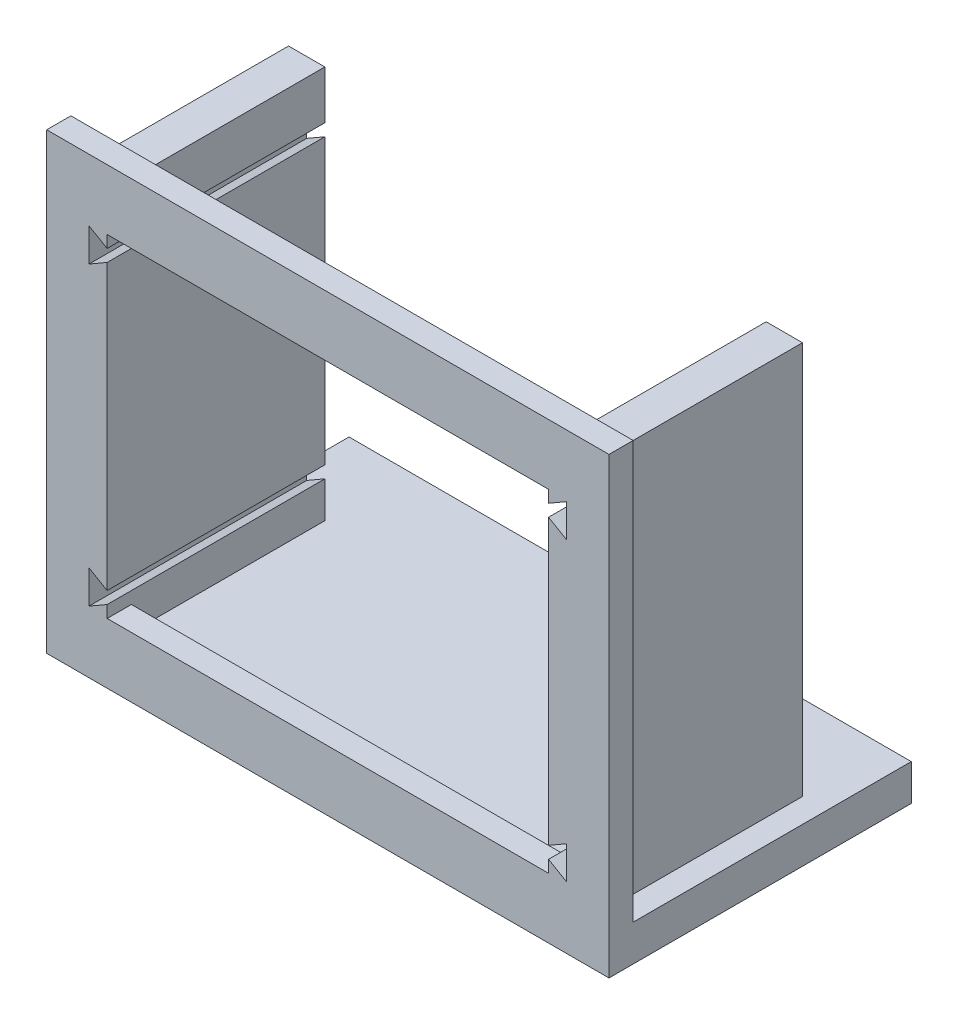
ISO-10303-21;
HEADER;
FILE_DESCRIPTION(('STEP AP214'),'2;1');
FILE_NAME('part.step','',(''),(''),'','','');
FILE_SCHEMA(('AUTOMOTIVE_DESIGN { 1 0 10303 214 1 1 1 1 }'));
ENDSEC;
DATA;
#1=APPLICATION_CONTEXT('core data for automotive mechanical design processes');
#2=APPLICATION_PROTOCOL_DEFINITION('international standard','automotive_design',2000,#1);
#3=PRODUCT_CONTEXT('',#1,'mechanical');
#4=PRODUCT('Part','Part','',(#3));
#5=PRODUCT_RELATED_PRODUCT_CATEGORY('part','',(#4));
#6=PRODUCT_DEFINITION_FORMATION('','',#4);
#7=PRODUCT_DEFINITION_CONTEXT('part definition',#1,'design');
#8=PRODUCT_DEFINITION('design','',#6,#7);
#9=PRODUCT_DEFINITION_SHAPE('','',#8);
#10=(LENGTH_UNIT() NAMED_UNIT(*) SI_UNIT(.MILLI.,.METRE.));
#11=(NAMED_UNIT(*) PLANE_ANGLE_UNIT() SI_UNIT($,.RADIAN.));
#12=(NAMED_UNIT(*) SI_UNIT($,.STERADIAN.) SOLID_ANGLE_UNIT());
#13=UNCERTAINTY_MEASURE_WITH_UNIT(LENGTH_MEASURE(1.E-05),#10,'distance_accuracy_value','');
#14=(GEOMETRIC_REPRESENTATION_CONTEXT(3) GLOBAL_UNCERTAINTY_ASSIGNED_CONTEXT((#13)) GLOBAL_UNIT_ASSIGNED_CONTEXT((#10,
#11,#12)) REPRESENTATION_CONTEXT('',''));
#15=CARTESIAN_POINT('',(0.,0.,0.));
#16=DIRECTION('',(0.,0.,1.));
#17=DIRECTION('',(1.,0.,0.));
#18=AXIS2_PLACEMENT_3D('',#15,#16,#17);
#19=CARTESIAN_POINT('',(-23.25,11.99,50.));
#20=DIRECTION('',(0.,0.,-1.));
#21=DIRECTION('',(-1.,0.,0.));
#22=AXIS2_PLACEMENT_3D('',#19,#20,#21);
#23=PLANE('',#22);
#24=DIRECTION('',(1.,0.,0.));
#25=VECTOR('',#24,1.);
#26=CARTESIAN_POINT('',(-23.25,12.,50.));
#27=LINE('',#26,#25);
#28=CARTESIAN_POINT('',(-23.25,12.,50.));
#29=VERTEX_POINT('',#28);
#30=CARTESIAN_POINT('',(23.25,12.,50.));
#31=VERTEX_POINT('',#30);
#32=EDGE_CURVE('E616',#29,#31,#27,.T.);
#33=ORIENTED_EDGE('',*,*,#32,.F.);
#34=DIRECTION('',(0.,-1.,0.));
#35=VECTOR('',#34,1.);
#36=CARTESIAN_POINT('',(-23.25,49.5,50.));
#37=LINE('',#36,#35);
#38=CARTESIAN_POINT('',(-23.25,15.,50.));
#39=VERTEX_POINT('',#38);
#40=EDGE_CURVE('E607',#39,#29,#37,.T.);
#41=ORIENTED_EDGE('',*,*,#40,.F.);
#42=DIRECTION('',(-1.,0.,0.));
#43=VECTOR('',#42,1.);
#44=CARTESIAN_POINT('',(0.,15.,50.));
#45=LINE('',#44,#43);
#46=CARTESIAN_POINT('',(23.25,15.,50.));
#47=VERTEX_POINT('',#46);
#48=EDGE_CURVE('E629',#47,#39,#45,.T.);
#49=ORIENTED_EDGE('',*,*,#48,.F.);
#50=DIRECTION('',(0.,1.,0.));
#51=VECTOR('',#50,1.);
#52=CARTESIAN_POINT('',(23.25,49.5,50.));
#53=LINE('',#52,#51);
#54=EDGE_CURVE('E615',#31,#47,#53,.T.);
#55=ORIENTED_EDGE('',*,*,#54,.F.);
#56=EDGE_LOOP('',(#33,#41,#49,#55));
#57=FACE_BOUND('',#56,.T.);
#58=ADVANCED_FACE('F382',(#57),#23,.T.);
#59=CARTESIAN_POINT('',(23.25,49.5,-75.01));
#60=DIRECTION('',(1.,0.,0.));
#61=DIRECTION('',(0.,0.,-1.));
#62=AXIS2_PLACEMENT_3D('',#59,#60,#61);
#63=PLANE('',#62);
#64=DIRECTION('',(0.,0.,1.));
#65=VECTOR('',#64,1.);
#66=CARTESIAN_POINT('',(23.25,12.,-75.01));
#67=LINE('',#66,#65);
#68=CARTESIAN_POINT('',(23.25,12.,75.));
#69=VERTEX_POINT('',#68);
#70=EDGE_CURVE('E628',#31,#69,#67,.T.);
#71=ORIENTED_EDGE('',*,*,#70,.F.);
#72=ORIENTED_EDGE('',*,*,#54,.T.);
#73=DIRECTION('',(0.,0.,-1.));
#74=VECTOR('',#73,1.);
#75=CARTESIAN_POINT('',(23.25,15.,0.));
#76=LINE('',#75,#74);
#77=CARTESIAN_POINT('',(23.25,15.,73.));
#78=VERTEX_POINT('',#77);
#79=EDGE_CURVE('E386',#78,#47,#76,.T.);
#80=ORIENTED_EDGE('',*,*,#79,.F.);
#81=DIRECTION('',(0.,-1.,0.));
#82=VECTOR('',#81,1.);
#83=CARTESIAN_POINT('',(23.25,80.,73.));
#84=LINE('',#83,#82);
#85=CARTESIAN_POINT('',(23.25,49.5,73.));
#86=VERTEX_POINT('',#85);
#87=EDGE_CURVE('E641',#86,#78,#84,.T.);
#88=ORIENTED_EDGE('',*,*,#87,.F.);
#89=DIRECTION('',(0.,0.,1.));
#90=VECTOR('',#89,1.);
#91=CARTESIAN_POINT('',(23.25,49.5,-75.01));
#92=LINE('',#91,#90);
#93=CARTESIAN_POINT('',(23.25,49.5,75.));
#94=VERTEX_POINT('',#93);
#95=EDGE_CURVE('E400',#86,#94,#92,.T.);
#96=ORIENTED_EDGE('',*,*,#95,.T.);
#97=DIRECTION('',(0.,-1.,0.));
#98=VECTOR('',#97,1.);
#99=CARTESIAN_POINT('',(23.25,80.,75.));
#100=LINE('',#99,#98);
#101=EDGE_CURVE('E646',#94,#69,#100,.T.);
#102=ORIENTED_EDGE('',*,*,#101,.T.);
#103=EDGE_LOOP('',(#71,#72,#80,#88,#96,#102));
#104=FACE_BOUND('',#103,.T.);
#105=ADVANCED_FACE('F950',(#104),#63,.T.);
#106=CARTESIAN_POINT('',(-18.25,44.5,27.2998905909406));
#107=DIRECTION('',(-1.,0.,0.));
#108=DIRECTION('',(0.,-1.,0.));
#109=AXIS2_PLACEMENT_3D('',#106,#107,#108);
#110=PLANE('',#109);
#111=DIRECTION('',(0.,0.,1.));
#112=VECTOR('',#111,1.);
#113=CARTESIAN_POINT('',(-18.25,42.5,27.2998905909406));
#114=LINE('',#113,#112);
#115=CARTESIAN_POINT('',(-18.25,42.5,57.));
#116=VERTEX_POINT('',#115);
#117=CARTESIAN_POINT('',(-18.25,42.5,75.));
#118=VERTEX_POINT('',#117);
#119=EDGE_CURVE('E872',#116,#118,#114,.T.);
#120=ORIENTED_EDGE('',*,*,#119,.T.);
#121=DIRECTION('',(0.,-1.,0.));
#122=VECTOR('',#121,1.);
#123=CARTESIAN_POINT('',(-18.25,44.5,75.));
#124=LINE('',#123,#122);
#125=CARTESIAN_POINT('',(-18.25,19.,75.));
#126=VERTEX_POINT('',#125);
#127=EDGE_CURVE('E831',#118,#126,#124,.T.);
#128=ORIENTED_EDGE('',*,*,#127,.T.);
#129=DIRECTION('',(0.,0.,1.));
#130=VECTOR('',#129,1.);
#131=CARTESIAN_POINT('',(-18.25,19.,27.2998905909406));
#132=LINE('',#131,#130);
#133=CARTESIAN_POINT('',(-18.25,19.,57.));
#134=VERTEX_POINT('',#133);
#135=EDGE_CURVE('E873',#134,#126,#132,.T.);
#136=ORIENTED_EDGE('',*,*,#135,.F.);
#137=DIRECTION('',(0.,-1.,0.));
#138=VECTOR('',#137,1.);
#139=CARTESIAN_POINT('',(-18.25,19.,57.));
#140=LINE('',#139,#138);
#141=EDGE_CURVE('E679',#116,#134,#140,.T.);
#142=ORIENTED_EDGE('',*,*,#141,.F.);
#143=EDGE_LOOP('',(#120,#128,#136,#142));
#144=FACE_BOUND('',#143,.T.);
#145=ADVANCED_FACE('F1052',(#144),#110,.F.);
#146=CARTESIAN_POINT('',(-19.75,41.6339745962155,27.2998905909406));
#147=DIRECTION('',(0.500000000000004,-0.866025403784436,0.));
#148=DIRECTION('',(0.866025403784436,0.500000000000005,0.));
#149=AXIS2_PLACEMENT_3D('',#146,#147,#148);
#150=PLANE('',#149);
#151=DIRECTION('',(0.,0.,1.));
#152=VECTOR('',#151,1.);
#153=CARTESIAN_POINT('',(-19.75,41.6339745962155,27.2998905909406));
#154=LINE('',#153,#152);
#155=CARTESIAN_POINT('',(-19.75,41.6339745962155,57.));
#156=VERTEX_POINT('',#155);
#157=CARTESIAN_POINT('',(-19.75,41.6339745962155,75.));
#158=VERTEX_POINT('',#157);
#159=EDGE_CURVE('E841',#156,#158,#154,.T.);
#160=ORIENTED_EDGE('',*,*,#159,.T.);
#161=DIRECTION('',(0.866025403784436,0.500000000000004,0.));
#162=VECTOR('',#161,1.);
#163=CARTESIAN_POINT('',(-19.75,41.6339745962155,75.));
#164=LINE('',#163,#162);
#165=EDGE_CURVE('E858',#158,#118,#164,.T.);
#166=ORIENTED_EDGE('',*,*,#165,.T.);
#167=ORIENTED_EDGE('',*,*,#119,.F.);
#168=DIRECTION('',(0.866025403784436,0.500000000000004,0.));
#169=VECTOR('',#168,1.);
#170=CARTESIAN_POINT('',(-18.25,42.5,57.));
#171=LINE('',#170,#169);
#172=EDGE_CURVE('E675',#156,#116,#171,.T.);
#173=ORIENTED_EDGE('',*,*,#172,.F.);
#174=EDGE_LOOP('',(#160,#166,#167,#173));
#175=FACE_BOUND('',#174,.T.);
#176=ADVANCED_FACE('F1054',(#175),#150,.F.);
#177=CARTESIAN_POINT('',(-19.75,44.3660254037844,27.2998905909406));
#178=DIRECTION('',(-1.,0.,0.));
#179=DIRECTION('',(0.,0.,1.));
#180=AXIS2_PLACEMENT_3D('',#177,#178,#179);
#181=PLANE('',#180);
#182=DIRECTION('',(0.,0.,1.));
#183=VECTOR('',#182,1.);
#184=CARTESIAN_POINT('',(-19.75,44.3660254037844,27.2998905909406));
#185=LINE('',#184,#183);
#186=CARTESIAN_POINT('',(-19.75,44.3660254037844,57.));
#187=VERTEX_POINT('',#186);
#188=CARTESIAN_POINT('',(-19.75,44.3660254037844,75.));
#189=VERTEX_POINT('',#188);
#190=EDGE_CURVE('E857',#187,#189,#185,.T.);
#191=ORIENTED_EDGE('',*,*,#190,.T.);
#192=DIRECTION('',(0.,-1.,0.));
#193=VECTOR('',#192,1.);
#194=CARTESIAN_POINT('',(-19.75,44.3660254037844,75.));
#195=LINE('',#194,#193);
#196=EDGE_CURVE('E862',#189,#158,#195,.T.);
#197=ORIENTED_EDGE('',*,*,#196,.T.);
#198=ORIENTED_EDGE('',*,*,#159,.F.);
#199=DIRECTION('',(0.,-1.,0.));
#200=VECTOR('',#199,1.);
#201=CARTESIAN_POINT('',(-19.75,41.6339745962155,57.));
#202=LINE('',#201,#200);
#203=EDGE_CURVE('E671',#187,#156,#202,.T.);
#204=ORIENTED_EDGE('',*,*,#203,.F.);
#205=EDGE_LOOP('',(#191,#197,#198,#204));
#206=FACE_BOUND('',#205,.T.);
#207=ADVANCED_FACE('F1062',(#206),#181,.F.);
#208=CARTESIAN_POINT('',(-18.25,43.5,27.2998905909406));
#209=DIRECTION('',(0.500000000000004,0.866025403784436,0.));
#210=DIRECTION('',(-0.866025403784436,0.500000000000005,0.));
#211=AXIS2_PLACEMENT_3D('',#208,#209,#210);
#212=PLANE('',#211);
#213=DIRECTION('',(0.,0.,1.));
#214=VECTOR('',#213,1.);
#215=CARTESIAN_POINT('',(-18.25,43.5,27.2998905909406));
#216=LINE('',#215,#214);
#217=CARTESIAN_POINT('',(-18.25,43.5,57.));
#218=VERTEX_POINT('',#217);
#219=CARTESIAN_POINT('',(-18.25,43.5,75.));
#220=VERTEX_POINT('',#219);
#221=EDGE_CURVE('E869',#218,#220,#216,.T.);
#222=ORIENTED_EDGE('',*,*,#221,.T.);
#223=DIRECTION('',(-0.866025403784436,0.500000000000004,0.));
#224=VECTOR('',#223,1.);
#225=CARTESIAN_POINT('',(-18.25,43.5,75.));
#226=LINE('',#225,#224);
#227=EDGE_CURVE('E853',#220,#189,#226,.T.);
#228=ORIENTED_EDGE('',*,*,#227,.T.);
#229=ORIENTED_EDGE('',*,*,#190,.F.);
#230=DIRECTION('',(-0.866025403784436,0.500000000000004,0.));
#231=VECTOR('',#230,1.);
#232=CARTESIAN_POINT('',(-19.75,44.3660254037844,57.));
#233=LINE('',#232,#231);
#234=EDGE_CURVE('E666',#218,#187,#233,.T.);
#235=ORIENTED_EDGE('',*,*,#234,.F.);
#236=EDGE_LOOP('',(#222,#228,#229,#235));
#237=FACE_BOUND('',#236,.T.);
#238=ADVANCED_FACE('F1085',(#237),#212,.F.);
#239=CARTESIAN_POINT('',(18.25,43.5,27.2998905909406));
#240=DIRECTION('',(0.500000000000004,-0.866025403784436,0.));
#241=DIRECTION('',(0.866025403784436,0.500000000000005,0.));
#242=AXIS2_PLACEMENT_3D('',#239,#240,#241);
#243=PLANE('',#242);
#244=DIRECTION('',(0.,0.,1.));
#245=VECTOR('',#244,1.);
#246=CARTESIAN_POINT('',(18.25,43.5,27.2998905909406));
#247=LINE('',#246,#245);
#248=CARTESIAN_POINT('',(18.25,43.5,57.));
#249=VERTEX_POINT('',#248);
#250=CARTESIAN_POINT('',(18.25,43.5,75.));
#251=VERTEX_POINT('',#250);
#252=EDGE_CURVE('E924',#249,#251,#247,.T.);
#253=ORIENTED_EDGE('',*,*,#252,.F.);
#254=DIRECTION('',(-0.866025403784436,-0.500000000000004,0.));
#255=VECTOR('',#254,1.);
#256=CARTESIAN_POINT('',(18.25,43.5,57.));
#257=LINE('',#256,#255);
#258=CARTESIAN_POINT('',(19.75,44.3660254037844,57.));
#259=VERTEX_POINT('',#258);
#260=EDGE_CURVE('E803',#259,#249,#257,.T.);
#261=ORIENTED_EDGE('',*,*,#260,.F.);
#262=DIRECTION('',(0.,0.,1.));
#263=VECTOR('',#262,1.);
#264=CARTESIAN_POINT('',(19.75,44.3660254037844,27.2998905909406));
#265=LINE('',#264,#263);
#266=CARTESIAN_POINT('',(19.75,44.3660254037844,75.));
#267=VERTEX_POINT('',#266);
#268=EDGE_CURVE('E909',#259,#267,#265,.T.);
#269=ORIENTED_EDGE('',*,*,#268,.T.);
#270=DIRECTION('',(0.866025403784436,0.500000000000004,0.));
#271=VECTOR('',#270,1.);
#272=CARTESIAN_POINT('',(18.25,43.5,75.));
#273=LINE('',#272,#271);
#274=EDGE_CURVE('E910',#251,#267,#273,.T.);
#275=ORIENTED_EDGE('',*,*,#274,.F.);
#276=EDGE_LOOP('',(#253,#261,#269,#275));
#277=FACE_BOUND('',#276,.T.);
#278=ADVANCED_FACE('F1017',(#277),#243,.T.);
#279=CARTESIAN_POINT('',(19.75,44.3660254037844,27.2998905909406));
#280=DIRECTION('',(-1.,0.,0.));
#281=DIRECTION('',(0.,0.,1.));
#282=AXIS2_PLACEMENT_3D('',#279,#280,#281);
#283=PLANE('',#282);
#284=ORIENTED_EDGE('',*,*,#268,.F.);
#285=DIRECTION('',(0.,1.,0.));
#286=VECTOR('',#285,1.);
#287=CARTESIAN_POINT('',(19.75,44.3660254037844,57.));
#288=LINE('',#287,#286);
#289=CARTESIAN_POINT('',(19.75,41.6339745962155,57.));
#290=VERTEX_POINT('',#289);
#291=EDGE_CURVE('E760',#290,#259,#288,.T.);
#292=ORIENTED_EDGE('',*,*,#291,.F.);
#293=DIRECTION('',(0.,0.,1.));
#294=VECTOR('',#293,1.);
#295=CARTESIAN_POINT('',(19.75,41.6339745962155,27.2998905909406));
#296=LINE('',#295,#294);
#297=CARTESIAN_POINT('',(19.75,41.6339745962155,75.));
#298=VERTEX_POINT('',#297);
#299=EDGE_CURVE('E904',#290,#298,#296,.T.);
#300=ORIENTED_EDGE('',*,*,#299,.T.);
#301=DIRECTION('',(0.,-1.,0.));
#302=VECTOR('',#301,1.);
#303=CARTESIAN_POINT('',(19.75,44.3660254037844,75.));
#304=LINE('',#303,#302);
#305=EDGE_CURVE('E905',#267,#298,#304,.T.);
#306=ORIENTED_EDGE('',*,*,#305,.F.);
#307=EDGE_LOOP('',(#284,#292,#300,#306));
#308=FACE_BOUND('',#307,.T.);
#309=ADVANCED_FACE('F1012',(#308),#283,.T.);
#310=CARTESIAN_POINT('',(19.75,41.6339745962155,27.2998905909406));
#311=DIRECTION('',(0.500000000000004,0.866025403784436,0.));
#312=DIRECTION('',(-0.866025403784436,0.500000000000005,0.));
#313=AXIS2_PLACEMENT_3D('',#310,#311,#312);
#314=PLANE('',#313);
#315=ORIENTED_EDGE('',*,*,#299,.F.);
#316=DIRECTION('',(0.866025403784436,-0.500000000000004,0.));
#317=VECTOR('',#316,1.);
#318=CARTESIAN_POINT('',(19.75,41.6339745962155,57.));
#319=LINE('',#318,#317);
#320=CARTESIAN_POINT('',(18.25,42.5,57.));
#321=VERTEX_POINT('',#320);
#322=EDGE_CURVE('E755',#321,#290,#319,.T.);
#323=ORIENTED_EDGE('',*,*,#322,.F.);
#324=DIRECTION('',(0.,0.,1.));
#325=VECTOR('',#324,1.);
#326=CARTESIAN_POINT('',(18.25,42.5,27.2998905909406));
#327=LINE('',#326,#325);
#328=CARTESIAN_POINT('',(18.25,42.5,75.));
#329=VERTEX_POINT('',#328);
#330=EDGE_CURVE('E919',#321,#329,#327,.T.);
#331=ORIENTED_EDGE('',*,*,#330,.T.);
#332=DIRECTION('',(-0.866025403784436,0.500000000000004,0.));
#333=VECTOR('',#332,1.);
#334=CARTESIAN_POINT('',(19.75,41.6339745962155,75.));
#335=LINE('',#334,#333);
#336=EDGE_CURVE('E892',#298,#329,#335,.T.);
#337=ORIENTED_EDGE('',*,*,#336,.F.);
#338=EDGE_LOOP('',(#315,#323,#331,#337));
#339=FACE_BOUND('',#338,.T.);
#340=ADVANCED_FACE('F1007',(#339),#314,.T.);
#341=CARTESIAN_POINT('',(18.25,44.5,27.2998905909406));
#342=DIRECTION('',(-1.,0.,0.));
#343=DIRECTION('',(0.,0.,1.));
#344=AXIS2_PLACEMENT_3D('',#341,#342,#343);
#345=PLANE('',#344);
#346=ORIENTED_EDGE('',*,*,#330,.F.);
#347=DIRECTION('',(0.,1.,0.));
#348=VECTOR('',#347,1.);
#349=CARTESIAN_POINT('',(18.25,42.5,57.));
#350=LINE('',#349,#348);
#351=CARTESIAN_POINT('',(18.25,19.,57.));
#352=VERTEX_POINT('',#351);
#353=EDGE_CURVE('E771',#352,#321,#350,.T.);
#354=ORIENTED_EDGE('',*,*,#353,.F.);
#355=DIRECTION('',(0.,0.,1.));
#356=VECTOR('',#355,1.);
#357=CARTESIAN_POINT('',(18.25,19.,27.2998905909406));
#358=LINE('',#357,#356);
#359=CARTESIAN_POINT('',(18.25,19.,75.));
#360=VERTEX_POINT('',#359);
#361=EDGE_CURVE('E927',#352,#360,#358,.T.);
#362=ORIENTED_EDGE('',*,*,#361,.T.);
#363=DIRECTION('',(0.,-1.,0.));
#364=VECTOR('',#363,1.);
#365=CARTESIAN_POINT('',(18.25,44.5,75.));
#366=LINE('',#365,#364);
#367=EDGE_CURVE('E820',#329,#360,#366,.T.);
#368=ORIENTED_EDGE('',*,*,#367,.F.);
#369=EDGE_LOOP('',(#346,#354,#362,#368));
#370=FACE_BOUND('',#369,.T.);
#371=ADVANCED_FACE('F1003',(#370),#345,.T.);
#372=CARTESIAN_POINT('',(19.75,19.8660254037845,27.2998905909406));
#373=DIRECTION('',(-0.500000000000004,0.866025403784436,0.));
#374=DIRECTION('',(-0.866025403784436,-0.500000000000005,0.));
#375=AXIS2_PLACEMENT_3D('',#372,#373,#374);
#376=PLANE('',#375);
#377=DIRECTION('',(0.,0.,1.));
#378=VECTOR('',#377,1.);
#379=CARTESIAN_POINT('',(19.75,19.8660254037845,27.2998905909406));
#380=LINE('',#379,#378);
#381=CARTESIAN_POINT('',(19.75,19.8660254037845,57.));
#382=VERTEX_POINT('',#381);
#383=CARTESIAN_POINT('',(19.75,19.8660254037845,75.));
#384=VERTEX_POINT('',#383);
#385=EDGE_CURVE('E932',#382,#384,#380,.T.);
#386=ORIENTED_EDGE('',*,*,#385,.T.);
#387=DIRECTION('',(-0.866025403784436,-0.500000000000004,0.));
#388=VECTOR('',#387,1.);
#389=CARTESIAN_POINT('',(19.75,19.8660254037845,75.));
#390=LINE('',#389,#388);
#391=EDGE_CURVE('E928',#384,#360,#390,.T.);
#392=ORIENTED_EDGE('',*,*,#391,.T.);
#393=ORIENTED_EDGE('',*,*,#361,.F.);
#394=DIRECTION('',(-0.866025403784436,-0.500000000000004,0.));
#395=VECTOR('',#394,1.);
#396=CARTESIAN_POINT('',(18.25,19.,57.));
#397=LINE('',#396,#395);
#398=EDGE_CURVE('E775',#382,#352,#397,.T.);
#399=ORIENTED_EDGE('',*,*,#398,.F.);
#400=EDGE_LOOP('',(#386,#392,#393,#399));
#401=FACE_BOUND('',#400,.T.);
#402=ADVANCED_FACE('F1042',(#401),#376,.F.);
#403=CARTESIAN_POINT('',(19.75,17.1339745962156,27.2998905909406));
#404=DIRECTION('',(1.,0.,0.));
#405=DIRECTION('',(0.,0.,-1.));
#406=AXIS2_PLACEMENT_3D('',#403,#404,#405);
#407=PLANE('',#406);
#408=DIRECTION('',(0.,0.,1.));
#409=VECTOR('',#408,1.);
#410=CARTESIAN_POINT('',(19.75,17.1339745962156,27.2998905909406));
#411=LINE('',#410,#409);
#412=CARTESIAN_POINT('',(19.75,17.1339745962156,57.));
#413=VERTEX_POINT('',#412);
#414=CARTESIAN_POINT('',(19.75,17.1339745962156,75.));
#415=VERTEX_POINT('',#414);
#416=EDGE_CURVE('E914',#413,#415,#411,.T.);
#417=ORIENTED_EDGE('',*,*,#416,.T.);
#418=DIRECTION('',(0.,1.,0.));
#419=VECTOR('',#418,1.);
#420=CARTESIAN_POINT('',(19.75,17.1339745962156,75.));
#421=LINE('',#420,#419);
#422=EDGE_CURVE('E933',#415,#384,#421,.T.);
#423=ORIENTED_EDGE('',*,*,#422,.T.);
#424=ORIENTED_EDGE('',*,*,#385,.F.);
#425=DIRECTION('',(0.,1.,0.));
#426=VECTOR('',#425,1.);
#427=CARTESIAN_POINT('',(19.75,19.8660254037845,57.));
#428=LINE('',#427,#426);
#429=EDGE_CURVE('E779',#413,#382,#428,.T.);
#430=ORIENTED_EDGE('',*,*,#429,.F.);
#431=EDGE_LOOP('',(#417,#423,#424,#430));
#432=FACE_BOUND('',#431,.T.);
#433=ADVANCED_FACE('F1039',(#432),#407,.F.);
#434=CARTESIAN_POINT('',(18.25,18.,27.2998905909406));
#435=DIRECTION('',(-0.500000000000004,-0.866025403784436,0.));
#436=DIRECTION('',(0.866025403784436,-0.500000000000005,0.));
#437=AXIS2_PLACEMENT_3D('',#434,#435,#436);
#438=PLANE('',#437);
#439=DIRECTION('',(0.,0.,1.));
#440=VECTOR('',#439,1.);
#441=CARTESIAN_POINT('',(18.25,18.,27.2998905909406));
#442=LINE('',#441,#440);
#443=CARTESIAN_POINT('',(18.25,18.,57.));
#444=VERTEX_POINT('',#443);
#445=CARTESIAN_POINT('',(18.25,18.,75.));
#446=VERTEX_POINT('',#445);
#447=EDGE_CURVE('E876',#444,#446,#442,.T.);
#448=ORIENTED_EDGE('',*,*,#447,.T.);
#449=DIRECTION('',(0.866025403784436,-0.500000000000004,0.));
#450=VECTOR('',#449,1.);
#451=CARTESIAN_POINT('',(18.25,18.,75.));
#452=LINE('',#451,#450);
#453=EDGE_CURVE('E740',#446,#415,#452,.T.);
#454=ORIENTED_EDGE('',*,*,#453,.T.);
#455=ORIENTED_EDGE('',*,*,#416,.F.);
#456=DIRECTION('',(0.866025403784436,-0.500000000000004,0.));
#457=VECTOR('',#456,1.);
#458=CARTESIAN_POINT('',(19.75,17.1339745962156,57.));
#459=LINE('',#458,#457);
#460=EDGE_CURVE('E783',#444,#413,#459,.T.);
#461=ORIENTED_EDGE('',*,*,#460,.F.);
#462=EDGE_LOOP('',(#448,#454,#455,#461));
#463=FACE_BOUND('',#462,.T.);
#464=ADVANCED_FACE('F1037',(#463),#438,.F.);
#465=CARTESIAN_POINT('',(-18.25,17.,27.2998905909406));
#466=DIRECTION('',(0.,-1.,0.));
#467=DIRECTION('',(1.,0.,0.));
#468=AXIS2_PLACEMENT_3D('',#465,#466,#467);
#469=PLANE('',#468);
#470=DIRECTION('',(0.,0.,1.));
#471=VECTOR('',#470,1.);
#472=CARTESIAN_POINT('',(-18.25,17.,27.2998905909406));
#473=LINE('',#472,#471);
#474=CARTESIAN_POINT('',(-18.25,17.,73.));
#475=VERTEX_POINT('',#474);
#476=CARTESIAN_POINT('',(-18.25,17.,75.));
#477=VERTEX_POINT('',#476);
#478=EDGE_CURVE('E814',#475,#477,#473,.T.);
#479=ORIENTED_EDGE('',*,*,#478,.T.);
#480=DIRECTION('',(1.,0.,0.));
#481=VECTOR('',#480,1.);
#482=CARTESIAN_POINT('',(-18.25,17.,75.));
#483=LINE('',#482,#481);
#484=CARTESIAN_POINT('',(18.25,17.,75.));
#485=VERTEX_POINT('',#484);
#486=EDGE_CURVE('E822',#477,#485,#483,.T.);
#487=ORIENTED_EDGE('',*,*,#486,.T.);
#488=DIRECTION('',(0.,0.,1.));
#489=VECTOR('',#488,1.);
#490=CARTESIAN_POINT('',(18.25,17.,27.2998905909406));
#491=LINE('',#490,#489);
#492=CARTESIAN_POINT('',(18.25,17.,73.));
#493=VERTEX_POINT('',#492);
#494=EDGE_CURVE('E836',#493,#485,#491,.T.);
#495=ORIENTED_EDGE('',*,*,#494,.F.);
#496=DIRECTION('',(1.,0.,0.));
#497=VECTOR('',#496,1.);
#498=CARTESIAN_POINT('',(-18.25,17.,73.));
#499=LINE('',#498,#497);
#500=EDGE_CURVE('E826',#475,#493,#499,.T.);
#501=ORIENTED_EDGE('',*,*,#500,.F.);
#502=EDGE_LOOP('',(#479,#487,#495,#501));
#503=FACE_BOUND('',#502,.T.);
#504=ADVANCED_FACE('F987',(#503),#469,.F.);
#505=CARTESIAN_POINT('',(-19.75,19.8660254037845,27.2998905909406));
#506=DIRECTION('',(-0.500000000000004,-0.866025403784436,0.));
#507=DIRECTION('',(0.866025403784436,-0.500000000000005,0.));
#508=AXIS2_PLACEMENT_3D('',#505,#506,#507);
#509=PLANE('',#508);
#510=DIRECTION('',(0.,0.,1.));
#511=VECTOR('',#510,1.);
#512=CARTESIAN_POINT('',(-19.75,19.8660254037845,27.2998905909406));
#513=LINE('',#512,#511);
#514=CARTESIAN_POINT('',(-19.75,19.8660254037845,57.));
#515=VERTEX_POINT('',#514);
#516=CARTESIAN_POINT('',(-19.75,19.8660254037845,75.));
#517=VERTEX_POINT('',#516);
#518=EDGE_CURVE('E882',#515,#517,#513,.T.);
#519=ORIENTED_EDGE('',*,*,#518,.F.);
#520=DIRECTION('',(-0.866025403784436,0.500000000000004,0.));
#521=VECTOR('',#520,1.);
#522=CARTESIAN_POINT('',(-19.75,19.8660254037845,57.));
#523=LINE('',#522,#521);
#524=EDGE_CURVE('E683',#134,#515,#523,.T.);
#525=ORIENTED_EDGE('',*,*,#524,.F.);
#526=ORIENTED_EDGE('',*,*,#135,.T.);
#527=DIRECTION('',(0.866025403784436,-0.500000000000004,0.));
#528=VECTOR('',#527,1.);
#529=CARTESIAN_POINT('',(-19.75,19.8660254037845,75.));
#530=LINE('',#529,#528);
#531=EDGE_CURVE('E866',#517,#126,#530,.T.);
#532=ORIENTED_EDGE('',*,*,#531,.F.);
#533=EDGE_LOOP('',(#519,#525,#526,#532));
#534=FACE_BOUND('',#533,.T.);
#535=ADVANCED_FACE('F1097',(#534),#509,.T.);
#536=CARTESIAN_POINT('',(0.,0.,57.));
#537=DIRECTION('',(0.,0.,1.));
#538=DIRECTION('',(1.,0.,0.));
#539=AXIS2_PLACEMENT_3D('',#536,#537,#538);
#540=PLANE('',#539);
#541=ORIENTED_EDGE('',*,*,#291,.T.);
#542=ORIENTED_EDGE('',*,*,#260,.T.);
#543=DIRECTION('',(0.,1.,0.));
#544=VECTOR('',#543,1.);
#545=CARTESIAN_POINT('',(18.25,47.5,57.));
#546=LINE('',#545,#544);
#547=CARTESIAN_POINT('',(18.25,47.5,57.));
#548=VERTEX_POINT('',#547);
#549=EDGE_CURVE('E800',#249,#548,#546,.T.);
#550=ORIENTED_EDGE('',*,*,#549,.T.);
#551=DIRECTION('',(1.,0.,0.));
#552=VECTOR('',#551,1.);
#553=CARTESIAN_POINT('',(21.25,47.5,57.));
#554=LINE('',#553,#552);
#555=CARTESIAN_POINT('',(21.25,47.5,57.));
#556=VERTEX_POINT('',#555);
#557=EDGE_CURVE('E797',#548,#556,#554,.T.);
#558=ORIENTED_EDGE('',*,*,#557,.T.);
#559=DIRECTION('',(0.,-1.,0.));
#560=VECTOR('',#559,1.);
#561=CARTESIAN_POINT('',(21.25,47.5,57.));
#562=LINE('',#561,#560);
#563=CARTESIAN_POINT('',(21.25,15.,57.));
#564=VERTEX_POINT('',#563);
#565=EDGE_CURVE('E794',#556,#564,#562,.T.);
#566=ORIENTED_EDGE('',*,*,#565,.T.);
#567=DIRECTION('',(-1.,0.,0.));
#568=VECTOR('',#567,1.);
#569=CARTESIAN_POINT('',(18.25,15.,57.));
#570=LINE('',#569,#568);
#571=CARTESIAN_POINT('',(18.25,15.,57.));
#572=VERTEX_POINT('',#571);
#573=EDGE_CURVE('E791',#564,#572,#570,.T.);
#574=ORIENTED_EDGE('',*,*,#573,.T.);
#575=DIRECTION('',(0.,1.,0.));
#576=VECTOR('',#575,1.);
#577=CARTESIAN_POINT('',(18.25,18.,57.));
#578=LINE('',#577,#576);
#579=EDGE_CURVE('E787',#572,#444,#578,.T.);
#580=ORIENTED_EDGE('',*,*,#579,.T.);
#581=ORIENTED_EDGE('',*,*,#460,.T.);
#582=ORIENTED_EDGE('',*,*,#429,.T.);
#583=ORIENTED_EDGE('',*,*,#398,.T.);
#584=ORIENTED_EDGE('',*,*,#353,.T.);
#585=ORIENTED_EDGE('',*,*,#322,.T.);
#586=EDGE_LOOP('',(#541,#542,#550,#558,#566,#574,#580,#581,#582,#583,#584,#585));
#587=FACE_BOUND('',#586,.T.);
#588=ADVANCED_FACE('F1010',(#587),#540,.F.);
#589=ORIENTED_EDGE('',*,*,#447,.F.);
#590=ORIENTED_EDGE('',*,*,#579,.F.);
#591=DIRECTION('',(0.,0.,1.));
#592=VECTOR('',#591,1.);
#593=CARTESIAN_POINT('',(18.25,15.,57.));
#594=LINE('',#593,#592);
#595=CARTESIAN_POINT('',(18.25,15.,73.));
#596=VERTEX_POINT('',#595);
#597=EDGE_CURVE('E752',#572,#596,#594,.T.);
#598=ORIENTED_EDGE('',*,*,#597,.T.);
#599=DIRECTION('',(0.,1.,0.));
#600=VECTOR('',#599,1.);
#601=CARTESIAN_POINT('',(18.25,18.,73.));
#602=LINE('',#601,#600);
#603=EDGE_CURVE('E756',#596,#493,#602,.T.);
#604=ORIENTED_EDGE('',*,*,#603,.T.);
#605=ORIENTED_EDGE('',*,*,#494,.T.);
#606=EDGE_CURVE('E821',#446,#485,#366,.T.);
#607=ORIENTED_EDGE('',*,*,#606,.F.);
#608=EDGE_LOOP('',(#589,#590,#598,#604,#605,#607));
#609=FACE_BOUND('',#608,.T.);
#610=ADVANCED_FACE('F1033',(#609),#345,.T.);
#611=CARTESIAN_POINT('',(-100.,80.,73.));
#612=DIRECTION('',(0.,0.,-1.));
#613=DIRECTION('',(-1.,0.,0.));
#614=AXIS2_PLACEMENT_3D('',#611,#612,#613);
#615=PLANE('',#614);
#616=DIRECTION('',(1.,0.,0.));
#617=VECTOR('',#616,1.);
#618=CARTESIAN_POINT('',(-100.,15.,73.));
#619=LINE('',#618,#617);
#620=CARTESIAN_POINT('',(-18.25,15.,73.));
#621=VERTEX_POINT('',#620);
#622=EDGE_CURVE('E957',#621,#596,#619,.T.);
#623=ORIENTED_EDGE('',*,*,#622,.F.);
#624=DIRECTION('',(0.,-1.,0.));
#625=VECTOR('',#624,1.);
#626=CARTESIAN_POINT('',(-18.25,15.,73.));
#627=LINE('',#626,#625);
#628=EDGE_CURVE('E714',#475,#621,#627,.T.);
#629=ORIENTED_EDGE('',*,*,#628,.F.);
#630=ORIENTED_EDGE('',*,*,#500,.T.);
#631=ORIENTED_EDGE('',*,*,#603,.F.);
#632=EDGE_LOOP('',(#623,#629,#630,#631));
#633=FACE_BOUND('',#632,.T.);
#634=ADVANCED_FACE('F980',(#633),#615,.T.);
#635=DIRECTION('',(0.,0.,1.));
#636=VECTOR('',#635,1.);
#637=CARTESIAN_POINT('',(-18.25,18.,27.2998905909406));
#638=LINE('',#637,#636);
#639=CARTESIAN_POINT('',(-18.25,18.,57.));
#640=VERTEX_POINT('',#639);
#641=CARTESIAN_POINT('',(-18.25,18.,75.));
#642=VERTEX_POINT('',#641);
#643=EDGE_CURVE('E852',#640,#642,#638,.T.);
#644=ORIENTED_EDGE('',*,*,#643,.T.);
#645=EDGE_CURVE('E832',#642,#477,#124,.T.);
#646=ORIENTED_EDGE('',*,*,#645,.T.);
#647=ORIENTED_EDGE('',*,*,#478,.F.);
#648=ORIENTED_EDGE('',*,*,#628,.T.);
#649=DIRECTION('',(0.,0.,1.));
#650=VECTOR('',#649,1.);
#651=CARTESIAN_POINT('',(-18.25,15.,57.));
#652=LINE('',#651,#650);
#653=CARTESIAN_POINT('',(-18.25,15.,57.));
#654=VERTEX_POINT('',#653);
#655=EDGE_CURVE('E737',#654,#621,#652,.T.);
#656=ORIENTED_EDGE('',*,*,#655,.F.);
#657=DIRECTION('',(0.,-1.,0.));
#658=VECTOR('',#657,1.);
#659=CARTESIAN_POINT('',(-18.25,15.,57.));
#660=LINE('',#659,#658);
#661=EDGE_CURVE('E695',#640,#654,#660,.T.);
#662=ORIENTED_EDGE('',*,*,#661,.F.);
#663=EDGE_LOOP('',(#644,#646,#647,#648,#656,#662));
#664=FACE_BOUND('',#663,.T.);
#665=ADVANCED_FACE('F983',(#664),#110,.F.);
#666=CARTESIAN_POINT('',(0.,0.,57.));
#667=DIRECTION('',(0.,0.,-1.));
#668=DIRECTION('',(-1.,0.,0.));
#669=AXIS2_PLACEMENT_3D('',#666,#667,#668);
#670=PLANE('',#669);
#671=DIRECTION('',(0.,-1.,0.));
#672=VECTOR('',#671,1.);
#673=CARTESIAN_POINT('',(-18.25,43.5,57.));
#674=LINE('',#673,#672);
#675=CARTESIAN_POINT('',(-18.25,47.5,57.));
#676=VERTEX_POINT('',#675);
#677=EDGE_CURVE('E662',#676,#218,#674,.T.);
#678=ORIENTED_EDGE('',*,*,#677,.T.);
#679=ORIENTED_EDGE('',*,*,#234,.T.);
#680=ORIENTED_EDGE('',*,*,#203,.T.);
#681=ORIENTED_EDGE('',*,*,#172,.T.);
#682=ORIENTED_EDGE('',*,*,#141,.T.);
#683=ORIENTED_EDGE('',*,*,#524,.T.);
#684=DIRECTION('',(0.,-1.,0.));
#685=VECTOR('',#684,1.);
#686=CARTESIAN_POINT('',(-19.75,17.1339745962156,57.));
#687=LINE('',#686,#685);
#688=CARTESIAN_POINT('',(-19.75,17.1339745962156,57.));
#689=VERTEX_POINT('',#688);
#690=EDGE_CURVE('E687',#515,#689,#687,.T.);
#691=ORIENTED_EDGE('',*,*,#690,.T.);
#692=DIRECTION('',(0.866025403784436,0.500000000000004,0.));
#693=VECTOR('',#692,1.);
#694=CARTESIAN_POINT('',(-18.25,18.,57.));
#695=LINE('',#694,#693);
#696=EDGE_CURVE('E691',#689,#640,#695,.T.);
#697=ORIENTED_EDGE('',*,*,#696,.T.);
#698=ORIENTED_EDGE('',*,*,#661,.T.);
#699=DIRECTION('',(-1.,0.,0.));
#700=VECTOR('',#699,1.);
#701=CARTESIAN_POINT('',(-18.25,15.,57.));
#702=LINE('',#701,#700);
#703=CARTESIAN_POINT('',(-21.25,15.,57.));
#704=VERTEX_POINT('',#703);
#705=EDGE_CURVE('E699',#654,#704,#702,.T.);
#706=ORIENTED_EDGE('',*,*,#705,.T.);
#707=DIRECTION('',(0.,1.,0.));
#708=VECTOR('',#707,1.);
#709=CARTESIAN_POINT('',(-21.25,47.5,57.));
#710=LINE('',#709,#708);
#711=CARTESIAN_POINT('',(-21.25,47.5,57.));
#712=VERTEX_POINT('',#711);
#713=EDGE_CURVE('E703',#704,#712,#710,.T.);
#714=ORIENTED_EDGE('',*,*,#713,.T.);
#715=DIRECTION('',(1.,0.,0.));
#716=VECTOR('',#715,1.);
#717=CARTESIAN_POINT('',(-21.25,47.5,57.));
#718=LINE('',#717,#716);
#719=EDGE_CURVE('E706',#712,#676,#718,.T.);
#720=ORIENTED_EDGE('',*,*,#719,.T.);
#721=EDGE_LOOP('',(#678,#679,#680,#681,#682,#683,#691,#697,#698,#706,#714,#720));
#722=FACE_BOUND('',#721,.T.);
#723=ADVANCED_FACE('F971',(#722),#670,.T.);
#724=CARTESIAN_POINT('',(-21.25,47.5,57.));
#725=DIRECTION('',(1.,0.,0.));
#726=DIRECTION('',(0.,1.,0.));
#727=AXIS2_PLACEMENT_3D('',#724,#725,#726);
#728=PLANE('',#727);
#729=DIRECTION('',(0.,1.,0.));
#730=VECTOR('',#729,1.);
#731=CARTESIAN_POINT('',(-21.25,47.5,73.));
#732=LINE('',#731,#730);
#733=CARTESIAN_POINT('',(-21.25,15.,73.));
#734=VERTEX_POINT('',#733);
#735=CARTESIAN_POINT('',(-21.25,47.5,73.));
#736=VERTEX_POINT('',#735);
#737=EDGE_CURVE('E719',#734,#736,#732,.T.);
#738=ORIENTED_EDGE('',*,*,#737,.T.);
#739=DIRECTION('',(0.,0.,1.));
#740=VECTOR('',#739,1.);
#741=CARTESIAN_POINT('',(-21.25,47.5,57.));
#742=LINE('',#741,#740);
#743=EDGE_CURVE('E729',#712,#736,#742,.T.);
#744=ORIENTED_EDGE('',*,*,#743,.F.);
#745=ORIENTED_EDGE('',*,*,#713,.F.);
#746=DIRECTION('',(0.,0.,1.));
#747=VECTOR('',#746,1.);
#748=CARTESIAN_POINT('',(-21.25,15.,57.));
#749=LINE('',#748,#747);
#750=EDGE_CURVE('E733',#704,#734,#749,.T.);
#751=ORIENTED_EDGE('',*,*,#750,.T.);
#752=EDGE_LOOP('',(#738,#744,#745,#751));
#753=FACE_BOUND('',#752,.T.);
#754=ADVANCED_FACE('F968',(#753),#728,.F.);
#755=CARTESIAN_POINT('',(-21.25,47.5,57.));
#756=DIRECTION('',(0.,-1.,0.));
#757=DIRECTION('',(0.,0.,-1.));
#758=AXIS2_PLACEMENT_3D('',#755,#756,#757);
#759=PLANE('',#758);
#760=DIRECTION('',(1.,0.,0.));
#761=VECTOR('',#760,1.);
#762=CARTESIAN_POINT('',(-21.25,47.5,73.));
#763=LINE('',#762,#761);
#764=CARTESIAN_POINT('',(-18.25,47.5,73.));
#765=VERTEX_POINT('',#764);
#766=EDGE_CURVE('E667',#736,#765,#763,.T.);
#767=ORIENTED_EDGE('',*,*,#766,.T.);
#768=DIRECTION('',(0.,0.,1.));
#769=VECTOR('',#768,1.);
#770=CARTESIAN_POINT('',(-18.25,47.5,57.));
#771=LINE('',#770,#769);
#772=EDGE_CURVE('E709',#676,#765,#771,.T.);
#773=ORIENTED_EDGE('',*,*,#772,.F.);
#774=ORIENTED_EDGE('',*,*,#719,.F.);
#775=ORIENTED_EDGE('',*,*,#743,.T.);
#776=EDGE_LOOP('',(#767,#773,#774,#775));
#777=FACE_BOUND('',#776,.T.);
#778=ADVANCED_FACE('F1071',(#777),#759,.F.);
#779=ORIENTED_EDGE('',*,*,#221,.F.);
#780=ORIENTED_EDGE('',*,*,#677,.F.);
#781=ORIENTED_EDGE('',*,*,#772,.T.);
#782=DIRECTION('',(0.,-1.,0.));
#783=VECTOR('',#782,1.);
#784=CARTESIAN_POINT('',(-18.25,43.5,73.));
#785=LINE('',#784,#783);
#786=CARTESIAN_POINT('',(-18.25,44.5,73.));
#787=VERTEX_POINT('',#786);
#788=EDGE_CURVE('E710',#765,#787,#785,.T.);
#789=ORIENTED_EDGE('',*,*,#788,.T.);
#790=DIRECTION('',(0.,0.,1.));
#791=VECTOR('',#790,1.);
#792=CARTESIAN_POINT('',(-18.25,44.5,27.2998905909406));
#793=LINE('',#792,#791);
#794=CARTESIAN_POINT('',(-18.25,44.5,75.));
#795=VERTEX_POINT('',#794);
#796=EDGE_CURVE('E815',#787,#795,#793,.T.);
#797=ORIENTED_EDGE('',*,*,#796,.T.);
#798=EDGE_CURVE('E827',#795,#220,#124,.T.);
#799=ORIENTED_EDGE('',*,*,#798,.T.);
#800=EDGE_LOOP('',(#779,#780,#781,#789,#797,#799));
#801=FACE_BOUND('',#800,.T.);
#802=ADVANCED_FACE('F1057',(#801),#110,.F.);
#803=CARTESIAN_POINT('',(-18.25,44.5,27.2998905909406));
#804=DIRECTION('',(0.,-1.,0.));
#805=DIRECTION('',(1.,0.,0.));
#806=AXIS2_PLACEMENT_3D('',#803,#804,#805);
#807=PLANE('',#806);
#808=DIRECTION('',(1.,0.,0.));
#809=VECTOR('',#808,1.);
#810=CARTESIAN_POINT('',(-18.25,44.5,73.));
#811=LINE('',#810,#809);
#812=CARTESIAN_POINT('',(18.25,44.5,73.));
#813=VERTEX_POINT('',#812);
#814=EDGE_CURVE('E837',#787,#813,#811,.T.);
#815=ORIENTED_EDGE('',*,*,#814,.T.);
#816=DIRECTION('',(0.,0.,1.));
#817=VECTOR('',#816,1.);
#818=CARTESIAN_POINT('',(18.25,44.5,27.2998905909406));
#819=LINE('',#818,#817);
#820=CARTESIAN_POINT('',(18.25,44.5,75.));
#821=VERTEX_POINT('',#820);
#822=EDGE_CURVE('E844',#813,#821,#819,.T.);
#823=ORIENTED_EDGE('',*,*,#822,.T.);
#824=DIRECTION('',(1.,0.,0.));
#825=VECTOR('',#824,1.);
#826=CARTESIAN_POINT('',(-18.25,44.5,75.));
#827=LINE('',#826,#825);
#828=EDGE_CURVE('E810',#795,#821,#827,.T.);
#829=ORIENTED_EDGE('',*,*,#828,.F.);
#830=ORIENTED_EDGE('',*,*,#796,.F.);
#831=EDGE_LOOP('',(#815,#823,#829,#830));
#832=FACE_BOUND('',#831,.T.);
#833=ADVANCED_FACE('F1070',(#832),#807,.T.);
#834=ORIENTED_EDGE('',*,*,#252,.T.);
#835=EDGE_CURVE('E816',#821,#251,#366,.T.);
#836=ORIENTED_EDGE('',*,*,#835,.F.);
#837=ORIENTED_EDGE('',*,*,#822,.F.);
#838=DIRECTION('',(0.,1.,0.));
#839=VECTOR('',#838,1.);
#840=CARTESIAN_POINT('',(18.25,47.5,73.));
#841=LINE('',#840,#839);
#842=CARTESIAN_POINT('',(18.25,47.5,73.));
#843=VERTEX_POINT('',#842);
#844=EDGE_CURVE('E715',#813,#843,#841,.T.);
#845=ORIENTED_EDGE('',*,*,#844,.T.);
#846=DIRECTION('',(0.,0.,1.));
#847=VECTOR('',#846,1.);
#848=CARTESIAN_POINT('',(18.25,47.5,57.));
#849=LINE('',#848,#847);
#850=EDGE_CURVE('E639',#548,#843,#849,.T.);
#851=ORIENTED_EDGE('',*,*,#850,.F.);
#852=ORIENTED_EDGE('',*,*,#549,.F.);
#853=EDGE_LOOP('',(#834,#836,#837,#845,#851,#852));
#854=FACE_BOUND('',#853,.T.);
#855=ADVANCED_FACE('F1021',(#854),#345,.T.);
#856=CARTESIAN_POINT('',(21.25,47.5,57.));
#857=DIRECTION('',(0.,-1.,0.));
#858=DIRECTION('',(0.,0.,-1.));
#859=AXIS2_PLACEMENT_3D('',#856,#857,#858);
#860=PLANE('',#859);
#861=DIRECTION('',(1.,0.,0.));
#862=VECTOR('',#861,1.);
#863=CARTESIAN_POINT('',(21.25,47.5,73.));
#864=LINE('',#863,#862);
#865=CARTESIAN_POINT('',(21.25,47.5,73.));
#866=VERTEX_POINT('',#865);
#867=EDGE_CURVE('E763',#843,#866,#864,.T.);
#868=ORIENTED_EDGE('',*,*,#867,.T.);
#869=DIRECTION('',(0.,0.,1.));
#870=VECTOR('',#869,1.);
#871=CARTESIAN_POINT('',(21.25,47.5,57.));
#872=LINE('',#871,#870);
#873=EDGE_CURVE('E744',#556,#866,#872,.T.);
#874=ORIENTED_EDGE('',*,*,#873,.F.);
#875=ORIENTED_EDGE('',*,*,#557,.F.);
#876=ORIENTED_EDGE('',*,*,#850,.T.);
#877=EDGE_LOOP('',(#868,#874,#875,#876));
#878=FACE_BOUND('',#877,.T.);
#879=ADVANCED_FACE('F1028',(#878),#860,.F.);
#880=CARTESIAN_POINT('',(21.25,47.5,57.));
#881=DIRECTION('',(-1.,0.,0.));
#882=DIRECTION('',(0.,-1.,0.));
#883=AXIS2_PLACEMENT_3D('',#880,#881,#882);
#884=PLANE('',#883);
#885=DIRECTION('',(0.,-1.,0.));
#886=VECTOR('',#885,1.);
#887=CARTESIAN_POINT('',(21.25,47.5,73.));
#888=LINE('',#887,#886);
#889=CARTESIAN_POINT('',(21.25,15.,73.));
#890=VERTEX_POINT('',#889);
#891=EDGE_CURVE('E759',#866,#890,#888,.T.);
#892=ORIENTED_EDGE('',*,*,#891,.T.);
#893=DIRECTION('',(0.,0.,1.));
#894=VECTOR('',#893,1.);
#895=CARTESIAN_POINT('',(21.25,15.,57.));
#896=LINE('',#895,#894);
#897=EDGE_CURVE('E748',#564,#890,#896,.T.);
#898=ORIENTED_EDGE('',*,*,#897,.F.);
#899=ORIENTED_EDGE('',*,*,#565,.F.);
#900=ORIENTED_EDGE('',*,*,#873,.T.);
#901=EDGE_LOOP('',(#892,#898,#899,#900));
#902=FACE_BOUND('',#901,.T.);
#903=ADVANCED_FACE('F1032',(#902),#884,.F.);
#904=CARTESIAN_POINT('',(0.,15.,0.));
#905=DIRECTION('',(0.,1.,0.));
#906=DIRECTION('',(0.,0.,1.));
#907=AXIS2_PLACEMENT_3D('',#904,#905,#906);
#908=PLANE('',#907);
#909=ORIENTED_EDGE('',*,*,#79,.T.);
#910=ORIENTED_EDGE('',*,*,#48,.T.);
#911=DIRECTION('',(0.,0.,1.));
#912=VECTOR('',#911,1.);
#913=CARTESIAN_POINT('',(-23.25,15.,0.));
#914=LINE('',#913,#912);
#915=CARTESIAN_POINT('',(-23.25,15.,73.));
#916=VERTEX_POINT('',#915);
#917=EDGE_CURVE('E612',#39,#916,#914,.T.);
#918=ORIENTED_EDGE('',*,*,#917,.T.);
#919=EDGE_CURVE('E661',#916,#734,#619,.T.);
#920=ORIENTED_EDGE('',*,*,#919,.T.);
#921=ORIENTED_EDGE('',*,*,#750,.F.);
#922=ORIENTED_EDGE('',*,*,#705,.F.);
#923=ORIENTED_EDGE('',*,*,#655,.T.);
#924=ORIENTED_EDGE('',*,*,#622,.T.);
#925=ORIENTED_EDGE('',*,*,#597,.F.);
#926=ORIENTED_EDGE('',*,*,#573,.F.);
#927=ORIENTED_EDGE('',*,*,#897,.T.);
#928=EDGE_CURVE('E923',#890,#78,#619,.T.);
#929=ORIENTED_EDGE('',*,*,#928,.T.);
#930=EDGE_LOOP('',(#909,#910,#918,#920,#921,#922,#923,#924,#925,#926,#927,#929));
#931=FACE_BOUND('',#930,.T.);
#932=ADVANCED_FACE('F384',(#931),#908,.T.);
#933=CARTESIAN_POINT('',(-23.25,49.5,-75.01));
#934=DIRECTION('',(0.,1.,0.));
#935=DIRECTION('',(0.,0.,1.));
#936=AXIS2_PLACEMENT_3D('',#933,#934,#935);
#937=PLANE('',#936);
#938=DIRECTION('',(1.,0.,0.));
#939=VECTOR('',#938,1.);
#940=CARTESIAN_POINT('',(-100.,49.5,73.));
#941=LINE('',#940,#939);
#942=CARTESIAN_POINT('',(-23.25,49.5,73.));
#943=VERTEX_POINT('',#942);
#944=EDGE_CURVE('E647',#943,#86,#941,.T.);
#945=ORIENTED_EDGE('',*,*,#944,.F.);
#946=DIRECTION('',(0.,0.,1.));
#947=VECTOR('',#946,1.);
#948=CARTESIAN_POINT('',(-23.25,49.5,-75.01));
#949=LINE('',#948,#947);
#950=CARTESIAN_POINT('',(-23.25,49.5,75.));
#951=VERTEX_POINT('',#950);
#952=EDGE_CURVE('E408',#943,#951,#949,.T.);
#953=ORIENTED_EDGE('',*,*,#952,.T.);
#954=DIRECTION('',(1.,0.,0.));
#955=VECTOR('',#954,1.);
#956=CARTESIAN_POINT('',(-100.,49.5,75.));
#957=LINE('',#956,#955);
#958=EDGE_CURVE('E1369',#951,#94,#957,.T.);
#959=ORIENTED_EDGE('',*,*,#958,.T.);
#960=ORIENTED_EDGE('',*,*,#95,.F.);
#961=EDGE_LOOP('',(#945,#953,#959,#960));
#962=FACE_BOUND('',#961,.T.);
#963=ADVANCED_FACE('F1116',(#962),#937,.T.);
#964=ORIENTED_EDGE('',*,*,#944,.T.);
#965=ORIENTED_EDGE('',*,*,#87,.T.);
#966=ORIENTED_EDGE('',*,*,#928,.F.);
#967=ORIENTED_EDGE('',*,*,#891,.F.);
#968=ORIENTED_EDGE('',*,*,#867,.F.);
#969=ORIENTED_EDGE('',*,*,#844,.F.);
#970=ORIENTED_EDGE('',*,*,#814,.F.);
#971=ORIENTED_EDGE('',*,*,#788,.F.);
#972=ORIENTED_EDGE('',*,*,#766,.F.);
#973=ORIENTED_EDGE('',*,*,#737,.F.);
#974=ORIENTED_EDGE('',*,*,#919,.F.);
#975=DIRECTION('',(0.,1.,0.));
#976=VECTOR('',#975,1.);
#977=CARTESIAN_POINT('',(-23.25,80.,73.));
#978=LINE('',#977,#976);
#979=EDGE_CURVE('E654',#916,#943,#978,.T.);
#980=ORIENTED_EDGE('',*,*,#979,.T.);
#981=EDGE_LOOP('',(#964,#965,#966,#967,#968,#969,#970,#971,#972,#973,#974,#980));
#982=FACE_BOUND('',#981,.T.);
#983=ADVANCED_FACE('F964',(#982),#615,.T.);
#984=CARTESIAN_POINT('',(-18.25,18.,27.2998905909406));
#985=DIRECTION('',(-0.500000000000004,0.866025403784436,0.));
#986=DIRECTION('',(-0.866025403784436,-0.500000000000005,0.));
#987=AXIS2_PLACEMENT_3D('',#984,#985,#986);
#988=PLANE('',#987);
#989=ORIENTED_EDGE('',*,*,#643,.F.);
#990=ORIENTED_EDGE('',*,*,#696,.F.);
#991=DIRECTION('',(0.,0.,1.));
#992=VECTOR('',#991,1.);
#993=CARTESIAN_POINT('',(-19.75,17.1339745962156,27.2998905909406));
#994=LINE('',#993,#992);
#995=CARTESIAN_POINT('',(-19.75,17.1339745962156,75.));
#996=VERTEX_POINT('',#995);
#997=EDGE_CURVE('E887',#689,#996,#994,.T.);
#998=ORIENTED_EDGE('',*,*,#997,.T.);
#999=DIRECTION('',(-0.866025403784436,-0.500000000000004,0.));
#1000=VECTOR('',#999,1.);
#1001=CARTESIAN_POINT('',(-18.25,18.,75.));
#1002=LINE('',#1001,#1000);
#1003=EDGE_CURVE('E888',#642,#996,#1002,.T.);
#1004=ORIENTED_EDGE('',*,*,#1003,.F.);
#1005=EDGE_LOOP('',(#989,#990,#998,#1004));
#1006=FACE_BOUND('',#1005,.T.);
#1007=ADVANCED_FACE('F1104',(#1006),#988,.T.);
#1008=CARTESIAN_POINT('',(-19.75,17.1339745962156,27.2998905909406));
#1009=DIRECTION('',(1.,0.,0.));
#1010=DIRECTION('',(0.,0.,-1.));
#1011=AXIS2_PLACEMENT_3D('',#1008,#1009,#1010);
#1012=PLANE('',#1011);
#1013=ORIENTED_EDGE('',*,*,#997,.F.);
#1014=ORIENTED_EDGE('',*,*,#690,.F.);
#1015=ORIENTED_EDGE('',*,*,#518,.T.);
#1016=DIRECTION('',(0.,1.,0.));
#1017=VECTOR('',#1016,1.);
#1018=CARTESIAN_POINT('',(-19.75,17.1339745962156,75.));
#1019=LINE('',#1018,#1017);
#1020=EDGE_CURVE('E883',#996,#517,#1019,.T.);
#1021=ORIENTED_EDGE('',*,*,#1020,.F.);
#1022=EDGE_LOOP('',(#1013,#1014,#1015,#1021));
#1023=FACE_BOUND('',#1022,.T.);
#1024=ADVANCED_FACE('F1065',(#1023),#1012,.T.);
#1025=CARTESIAN_POINT('',(-23.25,49.5,-75.01));
#1026=DIRECTION('',(-1.,0.,0.));
#1027=DIRECTION('',(0.,0.,1.));
#1028=AXIS2_PLACEMENT_3D('',#1025,#1026,#1027);
#1029=PLANE('',#1028);
#1030=ORIENTED_EDGE('',*,*,#917,.F.);
#1031=ORIENTED_EDGE('',*,*,#40,.T.);
#1032=DIRECTION('',(0.,0.,1.));
#1033=VECTOR('',#1032,1.);
#1034=CARTESIAN_POINT('',(-23.25,12.,-75.01));
#1035=LINE('',#1034,#1033);
#1036=CARTESIAN_POINT('',(-23.25,12.,75.));
#1037=VERTEX_POINT('',#1036);
#1038=EDGE_CURVE('E611',#29,#1037,#1035,.T.);
#1039=ORIENTED_EDGE('',*,*,#1038,.T.);
#1040=DIRECTION('',(0.,1.,0.));
#1041=VECTOR('',#1040,1.);
#1042=CARTESIAN_POINT('',(-23.25,80.,75.));
#1043=LINE('',#1042,#1041);
#1044=EDGE_CURVE('E392',#1037,#951,#1043,.T.);
#1045=ORIENTED_EDGE('',*,*,#1044,.T.);
#1046=ORIENTED_EDGE('',*,*,#952,.F.);
#1047=ORIENTED_EDGE('',*,*,#979,.F.);
#1048=EDGE_LOOP('',(#1030,#1031,#1039,#1045,#1046,#1047));
#1049=FACE_BOUND('',#1048,.T.);
#1050=ADVANCED_FACE('F609',(#1049),#1029,.T.);
#1051=CARTESIAN_POINT('',(-100.,80.,75.));
#1052=DIRECTION('',(0.,0.,-1.));
#1053=DIRECTION('',(-1.,0.,0.));
#1054=AXIS2_PLACEMENT_3D('',#1051,#1052,#1053);
#1055=PLANE('',#1054);
#1056=ORIENTED_EDGE('',*,*,#531,.T.);
#1057=ORIENTED_EDGE('',*,*,#127,.F.);
#1058=ORIENTED_EDGE('',*,*,#165,.F.);
#1059=ORIENTED_EDGE('',*,*,#196,.F.);
#1060=ORIENTED_EDGE('',*,*,#227,.F.);
#1061=ORIENTED_EDGE('',*,*,#798,.F.);
#1062=ORIENTED_EDGE('',*,*,#828,.T.);
#1063=ORIENTED_EDGE('',*,*,#835,.T.);
#1064=ORIENTED_EDGE('',*,*,#274,.T.);
#1065=ORIENTED_EDGE('',*,*,#305,.T.);
#1066=ORIENTED_EDGE('',*,*,#336,.T.);
#1067=ORIENTED_EDGE('',*,*,#367,.T.);
#1068=ORIENTED_EDGE('',*,*,#391,.F.);
#1069=ORIENTED_EDGE('',*,*,#422,.F.);
#1070=ORIENTED_EDGE('',*,*,#453,.F.);
#1071=ORIENTED_EDGE('',*,*,#606,.T.);
#1072=ORIENTED_EDGE('',*,*,#486,.F.);
#1073=ORIENTED_EDGE('',*,*,#645,.F.);
#1074=ORIENTED_EDGE('',*,*,#1003,.T.);
#1075=ORIENTED_EDGE('',*,*,#1020,.T.);
#1076=EDGE_LOOP('',(#1056,#1057,#1058,#1059,#1060,#1061,#1062,#1063,#1064,#1065,#1066,#1067,
#1068,#1069,#1070,#1071,#1072,#1073,#1074,#1075));
#1077=FACE_BOUND('',#1076,.T.);
#1078=ORIENTED_EDGE('',*,*,#101,.F.);
#1079=ORIENTED_EDGE('',*,*,#958,.F.);
#1080=ORIENTED_EDGE('',*,*,#1044,.F.);
#1081=DIRECTION('',(-1.,0.,0.));
#1082=VECTOR('',#1081,1.);
#1083=CARTESIAN_POINT('',(-100.,12.,75.));
#1084=LINE('',#1083,#1082);
#1085=EDGE_CURVE('E12',#69,#1037,#1084,.T.);
#1086=ORIENTED_EDGE('',*,*,#1085,.F.);
#1087=EDGE_LOOP('',(#1078,#1079,#1080,#1086));
#1088=FACE_BOUND('',#1087,.T.);
#1089=ADVANCED_FACE('F991',(#1077,#1088),#1055,.F.);
#1090=CARTESIAN_POINT('',(-23.25,12.,-75.01));
#1091=DIRECTION('',(0.,-1.,0.));
#1092=DIRECTION('',(0.,0.,-1.));
#1093=AXIS2_PLACEMENT_3D('',#1090,#1091,#1092);
#1094=PLANE('',#1093);
#1095=ORIENTED_EDGE('',*,*,#1038,.F.);
#1096=ORIENTED_EDGE('',*,*,#32,.T.);
#1097=ORIENTED_EDGE('',*,*,#70,.T.);
#1098=ORIENTED_EDGE('',*,*,#1085,.T.);
#1099=EDGE_LOOP('',(#1095,#1096,#1097,#1098));
#1100=FACE_BOUND('',#1099,.T.);
#1101=ADVANCED_FACE('F624',(#1100),#1094,.T.);
#1102=CLOSED_SHELL('',(#58,#105,#145,#176,#207,#238,#278,#309,#340,#371,#402,#433,#464,#504,
#535,#588,#610,#634,#665,#723,#754,#778,#802,#833,#855,#879,#903,#932,#963,#983,#1007,#1024,
#1050,#1089,#1101));
#1103=MANIFOLD_SOLID_BREP('B2',#1102);
#1104=ADVANCED_BREP_SHAPE_REPRESENTATION('',(#18,#1103),#14);
#1105=SHAPE_DEFINITION_REPRESENTATION(#9,#1104);
ENDSEC;
END-ISO-10303-21;
